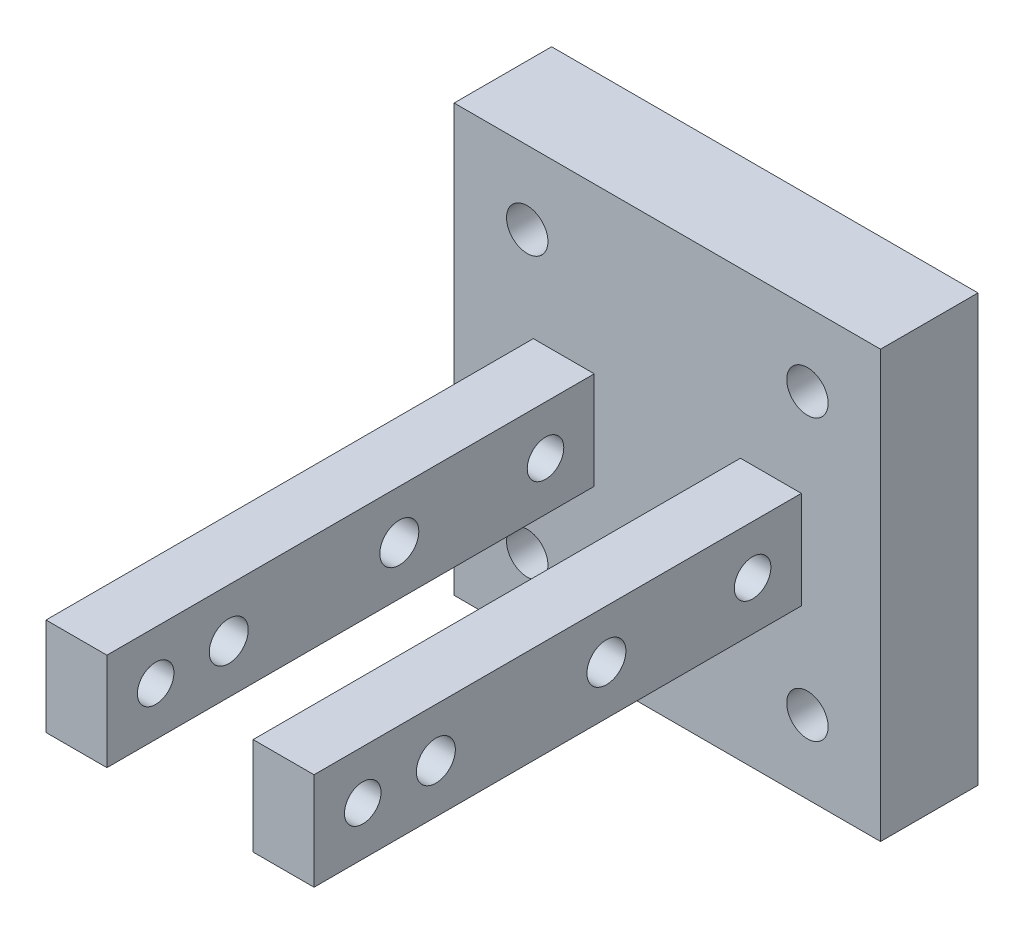
ISO-10303-21;
HEADER;
FILE_DESCRIPTION(('STEP AP214'),'2;1');
FILE_NAME('part.step','',(''),(''),'','','');
FILE_SCHEMA(('AUTOMOTIVE_DESIGN { 1 0 10303 214 1 1 1 1 }'));
ENDSEC;
DATA;
#1=APPLICATION_CONTEXT('core data for automotive mechanical design processes');
#2=APPLICATION_PROTOCOL_DEFINITION('international standard','automotive_design',2000,#1);
#3=PRODUCT_CONTEXT('',#1,'mechanical');
#4=PRODUCT('Part','Part','',(#3));
#5=PRODUCT_RELATED_PRODUCT_CATEGORY('part','',(#4));
#6=PRODUCT_DEFINITION_FORMATION('','',#4);
#7=PRODUCT_DEFINITION_CONTEXT('part definition',#1,'design');
#8=PRODUCT_DEFINITION('design','',#6,#7);
#9=PRODUCT_DEFINITION_SHAPE('','',#8);
#10=(LENGTH_UNIT() NAMED_UNIT(*) SI_UNIT(.MILLI.,.METRE.));
#11=(NAMED_UNIT(*) PLANE_ANGLE_UNIT() SI_UNIT($,.RADIAN.));
#12=(NAMED_UNIT(*) SI_UNIT($,.STERADIAN.) SOLID_ANGLE_UNIT());
#13=UNCERTAINTY_MEASURE_WITH_UNIT(LENGTH_MEASURE(1.E-05),#10,'distance_accuracy_value','');
#14=(GEOMETRIC_REPRESENTATION_CONTEXT(3) GLOBAL_UNCERTAINTY_ASSIGNED_CONTEXT((#13)) GLOBAL_UNIT_ASSIGNED_CONTEXT((#10,
#11,#12)) REPRESENTATION_CONTEXT('',''));
#15=CARTESIAN_POINT('',(0.,0.,0.));
#16=DIRECTION('',(0.,0.,1.));
#17=DIRECTION('',(1.,0.,0.));
#18=AXIS2_PLACEMENT_3D('',#15,#16,#17);
#19=CARTESIAN_POINT('',(0.,0.,8.));
#20=DIRECTION('',(0.,0.,1.));
#21=DIRECTION('',(1.,0.,0.));
#22=AXIS2_PLACEMENT_3D('',#19,#20,#21);
#23=PLANE('',#22);
#24=DIRECTION('',(0.,-1.,0.));
#25=VECTOR('',#24,1.);
#26=CARTESIAN_POINT('',(17.7,0.,8.));
#27=LINE('',#26,#25);
#28=CARTESIAN_POINT('',(17.7,-2.93142857142857,8.));
#29=VERTEX_POINT('',#28);
#30=CARTESIAN_POINT('',(17.7,-10.9314285714286,8.));
#31=VERTEX_POINT('',#30);
#32=EDGE_CURVE('E133',#29,#31,#27,.T.);
#33=ORIENTED_EDGE('',*,*,#32,.T.);
#34=DIRECTION('',(1.,0.,0.));
#35=VECTOR('',#34,1.);
#36=CARTESIAN_POINT('',(0.,-10.9314285714286,8.));
#37=LINE('',#36,#35);
#38=CARTESIAN_POINT('',(12.7,-10.9314285714286,8.));
#39=VERTEX_POINT('',#38);
#40=EDGE_CURVE('E147',#39,#31,#37,.T.);
#41=ORIENTED_EDGE('',*,*,#40,.F.);
#42=DIRECTION('',(0.,-1.,0.));
#43=VECTOR('',#42,1.);
#44=CARTESIAN_POINT('',(12.7,0.,8.));
#45=LINE('',#44,#43);
#46=CARTESIAN_POINT('',(12.7,-2.93142857142857,8.));
#47=VERTEX_POINT('',#46);
#48=EDGE_CURVE('E162',#47,#39,#45,.T.);
#49=ORIENTED_EDGE('',*,*,#48,.F.);
#50=DIRECTION('',(1.,0.,0.));
#51=VECTOR('',#50,1.);
#52=CARTESIAN_POINT('',(0.,-2.93142857142858,8.));
#53=LINE('',#52,#51);
#54=EDGE_CURVE('E159',#47,#29,#53,.T.);
#55=ORIENTED_EDGE('',*,*,#54,.T.);
#56=EDGE_LOOP('',(#33,#41,#49,#55));
#57=FACE_BOUND('',#56,.T.);
#58=CARTESIAN_POINT('',(-4.8,-18.4314285714286,8.));
#59=DIRECTION('',(0.,0.,1.));
#60=DIRECTION('',(1.,0.,0.));
#61=AXIS2_PLACEMENT_3D('',#58,#59,#60);
#62=CIRCLE('',#61,1.7);
#63=CARTESIAN_POINT('',(-3.1,-18.4314285714286,8.));
#64=VERTEX_POINT('',#63);
#65=EDGE_CURVE('E204',#64,#64,#62,.T.);
#66=ORIENTED_EDGE('',*,*,#65,.F.);
#67=EDGE_LOOP('',(#66));
#68=FACE_BOUND('',#67,.T.);
#69=CARTESIAN_POINT('',(-4.80000000000001,4.56857142857142,8.));
#70=DIRECTION('',(0.,0.,1.));
#71=DIRECTION('',(1.,0.,0.));
#72=AXIS2_PLACEMENT_3D('',#69,#70,#71);
#73=CIRCLE('',#72,1.7);
#74=CARTESIAN_POINT('',(-3.10000000000001,4.56857142857142,8.));
#75=VERTEX_POINT('',#74);
#76=EDGE_CURVE('E216',#75,#75,#73,.T.);
#77=ORIENTED_EDGE('',*,*,#76,.F.);
#78=EDGE_LOOP('',(#77));
#79=FACE_BOUND('',#78,.T.);
#80=DIRECTION('',(0.,-1.,0.));
#81=VECTOR('',#80,1.);
#82=CARTESIAN_POINT('',(-10.8,10.5685714285714,8.));
#83=LINE('',#82,#81);
#84=CARTESIAN_POINT('',(-10.8,10.5685714285714,8.));
#85=VERTEX_POINT('',#84);
#86=CARTESIAN_POINT('',(-10.8,-24.4314285714286,8.));
#87=VERTEX_POINT('',#86);
#88=EDGE_CURVE('E222',#85,#87,#83,.T.);
#89=ORIENTED_EDGE('',*,*,#88,.T.);
#90=DIRECTION('',(1.,0.,0.));
#91=VECTOR('',#90,1.);
#92=CARTESIAN_POINT('',(-10.8,-24.4314285714286,8.));
#93=LINE('',#92,#91);
#94=CARTESIAN_POINT('',(24.2,-24.4314285714286,8.));
#95=VERTEX_POINT('',#94);
#96=EDGE_CURVE('E225',#87,#95,#93,.T.);
#97=ORIENTED_EDGE('',*,*,#96,.T.);
#98=DIRECTION('',(0.,1.,0.));
#99=VECTOR('',#98,1.);
#100=CARTESIAN_POINT('',(24.2,10.5685714285714,8.));
#101=LINE('',#100,#99);
#102=CARTESIAN_POINT('',(24.2,10.5685714285714,8.));
#103=VERTEX_POINT('',#102);
#104=EDGE_CURVE('E228',#95,#103,#101,.T.);
#105=ORIENTED_EDGE('',*,*,#104,.T.);
#106=DIRECTION('',(-1.,0.,0.));
#107=VECTOR('',#106,1.);
#108=CARTESIAN_POINT('',(-10.8,10.5685714285714,8.));
#109=LINE('',#108,#107);
#110=EDGE_CURVE('E230',#103,#85,#109,.T.);
#111=ORIENTED_EDGE('',*,*,#110,.T.);
#112=EDGE_LOOP('',(#89,#97,#105,#111));
#113=FACE_BOUND('',#112,.T.);
#114=CARTESIAN_POINT('',(18.2,4.56857142857143,8.));
#115=DIRECTION('',(0.,0.,1.));
#116=DIRECTION('',(1.,0.,0.));
#117=AXIS2_PLACEMENT_3D('',#114,#115,#116);
#118=CIRCLE('',#117,1.7);
#119=CARTESIAN_POINT('',(19.9,4.56857142857143,8.));
#120=VERTEX_POINT('',#119);
#121=EDGE_CURVE('E210',#120,#120,#118,.T.);
#122=ORIENTED_EDGE('',*,*,#121,.F.);
#123=EDGE_LOOP('',(#122));
#124=FACE_BOUND('',#123,.T.);
#125=CARTESIAN_POINT('',(18.2,-18.4314285714286,8.));
#126=DIRECTION('',(0.,0.,1.));
#127=DIRECTION('',(1.,0.,0.));
#128=AXIS2_PLACEMENT_3D('',#125,#126,#127);
#129=CIRCLE('',#128,1.7);
#130=CARTESIAN_POINT('',(19.9,-18.4314285714286,8.));
#131=VERTEX_POINT('',#130);
#132=EDGE_CURVE('E198',#131,#131,#129,.T.);
#133=ORIENTED_EDGE('',*,*,#132,.F.);
#134=EDGE_LOOP('',(#133));
#135=FACE_BOUND('',#134,.T.);
#136=DIRECTION('',(0.,-1.,0.));
#137=VECTOR('',#136,1.);
#138=CARTESIAN_POINT('',(-4.30000000000001,0.,8.));
#139=LINE('',#138,#137);
#140=CARTESIAN_POINT('',(-4.30000000000001,-2.93142857142857,8.));
#141=VERTEX_POINT('',#140);
#142=CARTESIAN_POINT('',(-4.3,-10.9314285714286,8.));
#143=VERTEX_POINT('',#142);
#144=EDGE_CURVE('E60',#141,#143,#139,.T.);
#145=ORIENTED_EDGE('',*,*,#144,.F.);
#146=DIRECTION('',(-1.,0.,0.));
#147=VECTOR('',#146,1.);
#148=CARTESIAN_POINT('',(0.,-2.93142857142857,8.));
#149=LINE('',#148,#147);
#150=CARTESIAN_POINT('',(0.699999999999994,-2.93142857142857,8.));
#151=VERTEX_POINT('',#150);
#152=EDGE_CURVE('E138',#151,#141,#149,.T.);
#153=ORIENTED_EDGE('',*,*,#152,.F.);
#154=DIRECTION('',(0.,-1.,0.));
#155=VECTOR('',#154,1.);
#156=CARTESIAN_POINT('',(0.699999999999993,0.,8.));
#157=LINE('',#156,#155);
#158=CARTESIAN_POINT('',(0.699999999999996,-10.9314285714286,8.));
#159=VERTEX_POINT('',#158);
#160=EDGE_CURVE('E172',#151,#159,#157,.T.);
#161=ORIENTED_EDGE('',*,*,#160,.T.);
#162=DIRECTION('',(-1.,0.,0.));
#163=VECTOR('',#162,1.);
#164=CARTESIAN_POINT('',(0.,-10.9314285714286,8.));
#165=LINE('',#164,#163);
#166=EDGE_CURVE('E184',#159,#143,#165,.T.);
#167=ORIENTED_EDGE('',*,*,#166,.T.);
#168=EDGE_LOOP('',(#145,#153,#161,#167));
#169=FACE_BOUND('',#168,.T.);
#170=ADVANCED_FACE('F35',(#57,#68,#79,#113,#124,#135,#169),#23,.T.);
#171=CARTESIAN_POINT('',(0.,0.,0.));
#172=DIRECTION('',(0.,0.,1.));
#173=DIRECTION('',(1.,0.,0.));
#174=AXIS2_PLACEMENT_3D('',#171,#172,#173);
#175=PLANE('',#174);
#176=DIRECTION('',(0.,-1.,0.));
#177=VECTOR('',#176,1.);
#178=CARTESIAN_POINT('',(-10.8,10.5685714285714,0.));
#179=LINE('',#178,#177);
#180=CARTESIAN_POINT('',(-10.8,10.5685714285714,0.));
#181=VERTEX_POINT('',#180);
#182=CARTESIAN_POINT('',(-10.8,-24.4314285714286,0.));
#183=VERTEX_POINT('',#182);
#184=EDGE_CURVE('E219',#181,#183,#179,.T.);
#185=ORIENTED_EDGE('',*,*,#184,.F.);
#186=DIRECTION('',(-1.,0.,0.));
#187=VECTOR('',#186,1.);
#188=CARTESIAN_POINT('',(-10.8,10.5685714285714,0.));
#189=LINE('',#188,#187);
#190=CARTESIAN_POINT('',(24.2,10.5685714285714,0.));
#191=VERTEX_POINT('',#190);
#192=EDGE_CURVE('E226',#191,#181,#189,.T.);
#193=ORIENTED_EDGE('',*,*,#192,.F.);
#194=DIRECTION('',(0.,1.,0.));
#195=VECTOR('',#194,1.);
#196=CARTESIAN_POINT('',(24.2,10.5685714285714,0.));
#197=LINE('',#196,#195);
#198=CARTESIAN_POINT('',(24.2,-24.4314285714286,0.));
#199=VERTEX_POINT('',#198);
#200=EDGE_CURVE('E237',#199,#191,#197,.T.);
#201=ORIENTED_EDGE('',*,*,#200,.F.);
#202=DIRECTION('',(1.,0.,0.));
#203=VECTOR('',#202,1.);
#204=CARTESIAN_POINT('',(-10.8,-24.4314285714286,0.));
#205=LINE('',#204,#203);
#206=EDGE_CURVE('E235',#183,#199,#205,.T.);
#207=ORIENTED_EDGE('',*,*,#206,.F.);
#208=EDGE_LOOP('',(#185,#193,#201,#207));
#209=FACE_BOUND('',#208,.T.);
#210=CARTESIAN_POINT('',(-4.80000000000001,4.56857142857142,0.));
#211=DIRECTION('',(0.,0.,1.));
#212=DIRECTION('',(1.,0.,0.));
#213=AXIS2_PLACEMENT_3D('',#210,#211,#212);
#214=CIRCLE('',#213,1.7);
#215=CARTESIAN_POINT('',(-3.10000000000001,4.56857142857142,0.));
#216=VERTEX_POINT('',#215);
#217=EDGE_CURVE('E213',#216,#216,#214,.T.);
#218=ORIENTED_EDGE('',*,*,#217,.T.);
#219=EDGE_LOOP('',(#218));
#220=FACE_BOUND('',#219,.T.);
#221=CARTESIAN_POINT('',(18.2,4.56857142857143,0.));
#222=DIRECTION('',(0.,0.,1.));
#223=DIRECTION('',(1.,0.,0.));
#224=AXIS2_PLACEMENT_3D('',#221,#222,#223);
#225=CIRCLE('',#224,1.7);
#226=CARTESIAN_POINT('',(19.9,4.56857142857143,0.));
#227=VERTEX_POINT('',#226);
#228=EDGE_CURVE('E207',#227,#227,#225,.T.);
#229=ORIENTED_EDGE('',*,*,#228,.T.);
#230=EDGE_LOOP('',(#229));
#231=FACE_BOUND('',#230,.T.);
#232=CARTESIAN_POINT('',(-4.8,-18.4314285714286,0.));
#233=DIRECTION('',(0.,0.,1.));
#234=DIRECTION('',(1.,0.,0.));
#235=AXIS2_PLACEMENT_3D('',#232,#233,#234);
#236=CIRCLE('',#235,1.7);
#237=CARTESIAN_POINT('',(-3.1,-18.4314285714286,0.));
#238=VERTEX_POINT('',#237);
#239=EDGE_CURVE('E201',#238,#238,#236,.T.);
#240=ORIENTED_EDGE('',*,*,#239,.T.);
#241=EDGE_LOOP('',(#240));
#242=FACE_BOUND('',#241,.T.);
#243=CARTESIAN_POINT('',(18.2,-18.4314285714286,0.));
#244=DIRECTION('',(0.,0.,1.));
#245=DIRECTION('',(1.,0.,0.));
#246=AXIS2_PLACEMENT_3D('',#243,#244,#245);
#247=CIRCLE('',#246,1.7);
#248=CARTESIAN_POINT('',(19.9,-18.4314285714286,0.));
#249=VERTEX_POINT('',#248);
#250=EDGE_CURVE('E197',#249,#249,#247,.T.);
#251=ORIENTED_EDGE('',*,*,#250,.T.);
#252=EDGE_LOOP('',(#251));
#253=FACE_BOUND('',#252,.T.);
#254=ADVANCED_FACE('F318',(#209,#220,#231,#242,#253),#175,.F.);
#255=CARTESIAN_POINT('',(-10.8,10.5685714285714,8.));
#256=DIRECTION('',(1.,0.,0.));
#257=DIRECTION('',(0.,1.,0.));
#258=AXIS2_PLACEMENT_3D('',#255,#256,#257);
#259=PLANE('',#258);
#260=ORIENTED_EDGE('',*,*,#184,.T.);
#261=DIRECTION('',(0.,0.,-1.));
#262=VECTOR('',#261,1.);
#263=CARTESIAN_POINT('',(-10.8,-24.4314285714286,8.));
#264=LINE('',#263,#262);
#265=EDGE_CURVE('E11',#87,#183,#264,.T.);
#266=ORIENTED_EDGE('',*,*,#265,.F.);
#267=ORIENTED_EDGE('',*,*,#88,.F.);
#268=DIRECTION('',(0.,0.,-1.));
#269=VECTOR('',#268,1.);
#270=CARTESIAN_POINT('',(-10.8,10.5685714285714,8.));
#271=LINE('',#270,#269);
#272=EDGE_CURVE('E232',#85,#181,#271,.T.);
#273=ORIENTED_EDGE('',*,*,#272,.T.);
#274=EDGE_LOOP('',(#260,#266,#267,#273));
#275=FACE_BOUND('',#274,.T.);
#276=ADVANCED_FACE('F37',(#275),#259,.F.);
#277=CARTESIAN_POINT('',(-10.8,-24.4314285714286,8.));
#278=DIRECTION('',(0.,1.,0.));
#279=DIRECTION('',(0.,0.,1.));
#280=AXIS2_PLACEMENT_3D('',#277,#278,#279);
#281=PLANE('',#280);
#282=ORIENTED_EDGE('',*,*,#206,.T.);
#283=DIRECTION('',(0.,0.,-1.));
#284=VECTOR('',#283,1.);
#285=CARTESIAN_POINT('',(24.2,-24.4314285714286,8.));
#286=LINE('',#285,#284);
#287=EDGE_CURVE('E44',#95,#199,#286,.T.);
#288=ORIENTED_EDGE('',*,*,#287,.F.);
#289=ORIENTED_EDGE('',*,*,#96,.F.);
#290=ORIENTED_EDGE('',*,*,#265,.T.);
#291=EDGE_LOOP('',(#282,#288,#289,#290));
#292=FACE_BOUND('',#291,.T.);
#293=ADVANCED_FACE('F337',(#292),#281,.F.);
#294=CARTESIAN_POINT('',(24.2,10.5685714285714,8.));
#295=DIRECTION('',(-1.,0.,0.));
#296=DIRECTION('',(0.,-1.,0.));
#297=AXIS2_PLACEMENT_3D('',#294,#295,#296);
#298=PLANE('',#297);
#299=ORIENTED_EDGE('',*,*,#200,.T.);
#300=DIRECTION('',(0.,0.,-1.));
#301=VECTOR('',#300,1.);
#302=CARTESIAN_POINT('',(24.2,10.5685714285714,8.));
#303=LINE('',#302,#301);
#304=EDGE_CURVE('E242',#103,#191,#303,.T.);
#305=ORIENTED_EDGE('',*,*,#304,.F.);
#306=ORIENTED_EDGE('',*,*,#104,.F.);
#307=ORIENTED_EDGE('',*,*,#287,.T.);
#308=EDGE_LOOP('',(#299,#305,#306,#307));
#309=FACE_BOUND('',#308,.T.);
#310=ADVANCED_FACE('F334',(#309),#298,.F.);
#311=CARTESIAN_POINT('',(-10.8,10.5685714285714,8.));
#312=DIRECTION('',(0.,-1.,0.));
#313=DIRECTION('',(0.,0.,-1.));
#314=AXIS2_PLACEMENT_3D('',#311,#312,#313);
#315=PLANE('',#314);
#316=ORIENTED_EDGE('',*,*,#192,.T.);
#317=ORIENTED_EDGE('',*,*,#272,.F.);
#318=ORIENTED_EDGE('',*,*,#110,.F.);
#319=ORIENTED_EDGE('',*,*,#304,.T.);
#320=EDGE_LOOP('',(#316,#317,#318,#319));
#321=FACE_BOUND('',#320,.T.);
#322=ADVANCED_FACE('F331',(#321),#315,.F.);
#323=CARTESIAN_POINT('',(-4.80000000000001,4.56857142857142,8.));
#324=DIRECTION('',(0.,0.,-1.));
#325=DIRECTION('',(-1.,0.,0.));
#326=AXIS2_PLACEMENT_3D('',#323,#324,#325);
#327=CYLINDRICAL_SURFACE('',#326,1.7);
#328=ORIENTED_EDGE('',*,*,#76,.T.);
#329=EDGE_LOOP('',(#328));
#330=FACE_BOUND('',#329,.T.);
#331=ORIENTED_EDGE('',*,*,#217,.F.);
#332=EDGE_LOOP('',(#331));
#333=FACE_BOUND('',#332,.T.);
#334=ADVANCED_FACE('F328',(#330,#333),#327,.F.);
#335=CARTESIAN_POINT('',(18.2,4.56857142857143,8.));
#336=DIRECTION('',(0.,0.,-1.));
#337=DIRECTION('',(-1.,0.,0.));
#338=AXIS2_PLACEMENT_3D('',#335,#336,#337);
#339=CYLINDRICAL_SURFACE('',#338,1.7);
#340=ORIENTED_EDGE('',*,*,#121,.T.);
#341=EDGE_LOOP('',(#340));
#342=FACE_BOUND('',#341,.T.);
#343=ORIENTED_EDGE('',*,*,#228,.F.);
#344=EDGE_LOOP('',(#343));
#345=FACE_BOUND('',#344,.T.);
#346=ADVANCED_FACE('F376',(#342,#345),#339,.F.);
#347=CARTESIAN_POINT('',(-4.8,-18.4314285714286,8.));
#348=DIRECTION('',(0.,0.,-1.));
#349=DIRECTION('',(-1.,0.,0.));
#350=AXIS2_PLACEMENT_3D('',#347,#348,#349);
#351=CYLINDRICAL_SURFACE('',#350,1.7);
#352=ORIENTED_EDGE('',*,*,#65,.T.);
#353=EDGE_LOOP('',(#352));
#354=FACE_BOUND('',#353,.T.);
#355=ORIENTED_EDGE('',*,*,#239,.F.);
#356=EDGE_LOOP('',(#355));
#357=FACE_BOUND('',#356,.T.);
#358=ADVANCED_FACE('F366',(#354,#357),#351,.F.);
#359=CARTESIAN_POINT('',(18.2,-18.4314285714286,8.));
#360=DIRECTION('',(0.,0.,-1.));
#361=DIRECTION('',(-1.,0.,0.));
#362=AXIS2_PLACEMENT_3D('',#359,#360,#361);
#363=CYLINDRICAL_SURFACE('',#362,1.7);
#364=ORIENTED_EDGE('',*,*,#132,.T.);
#365=EDGE_LOOP('',(#364));
#366=FACE_BOUND('',#365,.T.);
#367=ORIENTED_EDGE('',*,*,#250,.F.);
#368=EDGE_LOOP('',(#367));
#369=FACE_BOUND('',#368,.T.);
#370=ADVANCED_FACE('F362',(#366,#369),#363,.F.);
#371=CARTESIAN_POINT('',(0.,-2.93142857142857,48.));
#372=DIRECTION('',(0.,-1.,0.));
#373=DIRECTION('',(1.,0.,0.));
#374=AXIS2_PLACEMENT_3D('',#371,#372,#373);
#375=PLANE('',#374);
#376=ORIENTED_EDGE('',*,*,#152,.T.);
#377=DIRECTION('',(0.,0.,-1.));
#378=VECTOR('',#377,1.);
#379=CARTESIAN_POINT('',(-4.30000000000001,-2.93142857142857,48.));
#380=LINE('',#379,#378);
#381=CARTESIAN_POINT('',(-4.30000000000001,-2.93142857142857,48.));
#382=VERTEX_POINT('',#381);
#383=EDGE_CURVE('E195',#382,#141,#380,.T.);
#384=ORIENTED_EDGE('',*,*,#383,.F.);
#385=DIRECTION('',(-1.,0.,0.));
#386=VECTOR('',#385,1.);
#387=CARTESIAN_POINT('',(0.,-2.93142857142857,48.));
#388=LINE('',#387,#386);
#389=CARTESIAN_POINT('',(0.699999999999994,-2.93142857142857,48.));
#390=VERTEX_POINT('',#389);
#391=EDGE_CURVE('E168',#390,#382,#388,.T.);
#392=ORIENTED_EDGE('',*,*,#391,.F.);
#393=DIRECTION('',(0.,0.,-1.));
#394=VECTOR('',#393,1.);
#395=CARTESIAN_POINT('',(0.699999999999994,-2.93142857142857,48.));
#396=LINE('',#395,#394);
#397=EDGE_CURVE('E180',#390,#151,#396,.T.);
#398=ORIENTED_EDGE('',*,*,#397,.T.);
#399=EDGE_LOOP('',(#376,#384,#392,#398));
#400=FACE_BOUND('',#399,.T.);
#401=ADVANCED_FACE('F365',(#400),#375,.F.);
#402=CARTESIAN_POINT('',(-4.30000000000001,0.,48.));
#403=DIRECTION('',(1.,0.,0.));
#404=DIRECTION('',(0.,1.,0.));
#405=AXIS2_PLACEMENT_3D('',#402,#403,#404);
#406=PLANE('',#405);
#407=CARTESIAN_POINT('',(-4.3,-6.93142857142857,12.));
#408=DIRECTION('',(-1.,0.,0.));
#409=DIRECTION('',(0.,-1.,0.));
#410=AXIS2_PLACEMENT_3D('',#407,#408,#409);
#411=CIRCLE('',#410,1.5);
#412=CARTESIAN_POINT('',(-4.3,-8.43142857142857,12.));
#413=VERTEX_POINT('',#412);
#414=EDGE_CURVE('E259',#413,#413,#411,.T.);
#415=ORIENTED_EDGE('',*,*,#414,.F.);
#416=EDGE_LOOP('',(#415));
#417=FACE_BOUND('',#416,.T.);
#418=CARTESIAN_POINT('',(-4.3,-6.93142857142856,44.));
#419=DIRECTION('',(-1.,0.,0.));
#420=DIRECTION('',(0.,-1.,0.));
#421=AXIS2_PLACEMENT_3D('',#418,#419,#420);
#422=CIRCLE('',#421,1.5);
#423=CARTESIAN_POINT('',(-4.3,-8.43142857142857,44.));
#424=VERTEX_POINT('',#423);
#425=EDGE_CURVE('E266',#424,#424,#422,.T.);
#426=ORIENTED_EDGE('',*,*,#425,.F.);
#427=EDGE_LOOP('',(#426));
#428=FACE_BOUND('',#427,.T.);
#429=CARTESIAN_POINT('',(-4.30000000000001,-6.93142857142858,38.));
#430=DIRECTION('',(1.,0.,0.));
#431=DIRECTION('',(0.,1.,0.));
#432=AXIS2_PLACEMENT_3D('',#429,#430,#431);
#433=CIRCLE('',#432,1.6);
#434=CARTESIAN_POINT('',(-4.30000000000001,-5.33142857142858,38.));
#435=VERTEX_POINT('',#434);
#436=EDGE_CURVE('E160',#435,#435,#433,.T.);
#437=ORIENTED_EDGE('',*,*,#436,.T.);
#438=EDGE_LOOP('',(#437));
#439=FACE_BOUND('',#438,.T.);
#440=CARTESIAN_POINT('',(-4.30000000000001,-6.93142857142858,24.));
#441=DIRECTION('',(1.,0.,0.));
#442=DIRECTION('',(0.,1.,0.));
#443=AXIS2_PLACEMENT_3D('',#440,#441,#442);
#444=CIRCLE('',#443,1.6);
#445=CARTESIAN_POINT('',(-4.30000000000001,-5.33142857142857,24.));
#446=VERTEX_POINT('',#445);
#447=EDGE_CURVE('E255',#446,#446,#444,.T.);
#448=ORIENTED_EDGE('',*,*,#447,.T.);
#449=EDGE_LOOP('',(#448));
#450=FACE_BOUND('',#449,.T.);
#451=ORIENTED_EDGE('',*,*,#144,.T.);
#452=DIRECTION('',(0.,0.,-1.));
#453=VECTOR('',#452,1.);
#454=CARTESIAN_POINT('',(-4.3,-10.9314285714286,48.));
#455=LINE('',#454,#453);
#456=CARTESIAN_POINT('',(-4.3,-10.9314285714286,48.));
#457=VERTEX_POINT('',#456);
#458=EDGE_CURVE('E192',#457,#143,#455,.T.);
#459=ORIENTED_EDGE('',*,*,#458,.F.);
#460=DIRECTION('',(0.,-1.,0.));
#461=VECTOR('',#460,1.);
#462=CARTESIAN_POINT('',(-4.30000000000001,0.,48.));
#463=LINE('',#462,#461);
#464=EDGE_CURVE('E171',#382,#457,#463,.T.);
#465=ORIENTED_EDGE('',*,*,#464,.F.);
#466=ORIENTED_EDGE('',*,*,#383,.T.);
#467=EDGE_LOOP('',(#451,#459,#465,#466));
#468=FACE_BOUND('',#467,.T.);
#469=ADVANCED_FACE('F294',(#417,#428,#439,#450,#468),#406,.F.);
#470=CARTESIAN_POINT('',(0.,-10.9314285714286,48.));
#471=DIRECTION('',(0.,-1.,0.));
#472=DIRECTION('',(0.,0.,-1.));
#473=AXIS2_PLACEMENT_3D('',#470,#471,#472);
#474=PLANE('',#473);
#475=ORIENTED_EDGE('',*,*,#166,.F.);
#476=DIRECTION('',(0.,0.,-1.));
#477=VECTOR('',#476,1.);
#478=CARTESIAN_POINT('',(0.699999999999996,-10.9314285714286,48.));
#479=LINE('',#478,#477);
#480=CARTESIAN_POINT('',(0.699999999999996,-10.9314285714286,48.));
#481=VERTEX_POINT('',#480);
#482=EDGE_CURVE('E189',#481,#159,#479,.T.);
#483=ORIENTED_EDGE('',*,*,#482,.F.);
#484=DIRECTION('',(-1.,0.,0.));
#485=VECTOR('',#484,1.);
#486=CARTESIAN_POINT('',(0.,-10.9314285714286,48.));
#487=LINE('',#486,#485);
#488=EDGE_CURVE('E174',#481,#457,#487,.T.);
#489=ORIENTED_EDGE('',*,*,#488,.T.);
#490=ORIENTED_EDGE('',*,*,#458,.T.);
#491=EDGE_LOOP('',(#475,#483,#489,#490));
#492=FACE_BOUND('',#491,.T.);
#493=ADVANCED_FACE('F459',(#492),#474,.T.);
#494=CARTESIAN_POINT('',(0.699999999999993,0.,48.));
#495=DIRECTION('',(1.,0.,0.));
#496=DIRECTION('',(0.,1.,0.));
#497=AXIS2_PLACEMENT_3D('',#494,#495,#496);
#498=PLANE('',#497);
#499=CARTESIAN_POINT('',(0.699999999999996,-6.93142857142857,12.));
#500=DIRECTION('',(1.,0.,0.));
#501=DIRECTION('',(0.,1.,0.));
#502=AXIS2_PLACEMENT_3D('',#499,#500,#501);
#503=CIRCLE('',#502,1.5);
#504=CARTESIAN_POINT('',(0.699999999999995,-5.43142857142857,12.));
#505=VERTEX_POINT('',#504);
#506=EDGE_CURVE('E278',#505,#505,#503,.T.);
#507=ORIENTED_EDGE('',*,*,#506,.F.);
#508=EDGE_LOOP('',(#507));
#509=FACE_BOUND('',#508,.T.);
#510=CARTESIAN_POINT('',(0.699999999999996,-6.93142857142856,44.));
#511=DIRECTION('',(1.,0.,0.));
#512=DIRECTION('',(0.,1.,0.));
#513=AXIS2_PLACEMENT_3D('',#510,#511,#512);
#514=CIRCLE('',#513,1.5);
#515=CARTESIAN_POINT('',(0.699999999999995,-5.43142857142856,44.));
#516=VERTEX_POINT('',#515);
#517=EDGE_CURVE('E263',#516,#516,#514,.T.);
#518=ORIENTED_EDGE('',*,*,#517,.F.);
#519=EDGE_LOOP('',(#518));
#520=FACE_BOUND('',#519,.T.);
#521=CARTESIAN_POINT('',(0.699999999999996,-6.93142857142857,38.));
#522=DIRECTION('',(1.,0.,0.));
#523=DIRECTION('',(0.,1.,0.));
#524=AXIS2_PLACEMENT_3D('',#521,#522,#523);
#525=CIRCLE('',#524,1.6);
#526=CARTESIAN_POINT('',(0.699999999999995,-5.33142857142858,38.));
#527=VERTEX_POINT('',#526);
#528=EDGE_CURVE('E254',#527,#527,#525,.T.);
#529=ORIENTED_EDGE('',*,*,#528,.F.);
#530=EDGE_LOOP('',(#529));
#531=FACE_BOUND('',#530,.T.);
#532=CARTESIAN_POINT('',(0.699999999999996,-6.93142857142857,24.));
#533=DIRECTION('',(1.,0.,0.));
#534=DIRECTION('',(0.,1.,0.));
#535=AXIS2_PLACEMENT_3D('',#532,#533,#534);
#536=CIRCLE('',#535,1.6);
#537=CARTESIAN_POINT('',(0.699999999999995,-5.33142857142857,24.));
#538=VERTEX_POINT('',#537);
#539=EDGE_CURVE('E250',#538,#538,#536,.T.);
#540=ORIENTED_EDGE('',*,*,#539,.F.);
#541=EDGE_LOOP('',(#540));
#542=FACE_BOUND('',#541,.T.);
#543=ORIENTED_EDGE('',*,*,#160,.F.);
#544=ORIENTED_EDGE('',*,*,#397,.F.);
#545=DIRECTION('',(0.,-1.,0.));
#546=VECTOR('',#545,1.);
#547=CARTESIAN_POINT('',(0.699999999999993,0.,48.));
#548=LINE('',#547,#546);
#549=EDGE_CURVE('E177',#390,#481,#548,.T.);
#550=ORIENTED_EDGE('',*,*,#549,.T.);
#551=ORIENTED_EDGE('',*,*,#482,.T.);
#552=EDGE_LOOP('',(#543,#544,#550,#551));
#553=FACE_BOUND('',#552,.T.);
#554=ADVANCED_FACE('F466',(#509,#520,#531,#542,#553),#498,.T.);
#555=CARTESIAN_POINT('',(0.,0.,48.));
#556=DIRECTION('',(0.,0.,1.));
#557=DIRECTION('',(1.,0.,0.));
#558=AXIS2_PLACEMENT_3D('',#555,#556,#557);
#559=PLANE('',#558);
#560=ORIENTED_EDGE('',*,*,#391,.T.);
#561=ORIENTED_EDGE('',*,*,#464,.T.);
#562=ORIENTED_EDGE('',*,*,#488,.F.);
#563=ORIENTED_EDGE('',*,*,#549,.F.);
#564=EDGE_LOOP('',(#560,#561,#562,#563));
#565=FACE_BOUND('',#564,.T.);
#566=ADVANCED_FACE('F475',(#565),#559,.T.);
#567=CARTESIAN_POINT('',(17.7,0.,48.));
#568=DIRECTION('',(1.,0.,0.));
#569=DIRECTION('',(0.,1.,0.));
#570=AXIS2_PLACEMENT_3D('',#567,#568,#569);
#571=PLANE('',#570);
#572=CARTESIAN_POINT('',(17.7,-6.93142857142856,12.));
#573=DIRECTION('',(1.,0.,0.));
#574=DIRECTION('',(0.,1.,0.));
#575=AXIS2_PLACEMENT_3D('',#572,#573,#574);
#576=CIRCLE('',#575,1.5);
#577=CARTESIAN_POINT('',(17.7,-5.43142857142856,12.));
#578=VERTEX_POINT('',#577);
#579=EDGE_CURVE('E275',#578,#578,#576,.T.);
#580=ORIENTED_EDGE('',*,*,#579,.F.);
#581=EDGE_LOOP('',(#580));
#582=FACE_BOUND('',#581,.T.);
#583=CARTESIAN_POINT('',(17.7,-6.93142857142856,44.));
#584=DIRECTION('',(1.,0.,0.));
#585=DIRECTION('',(0.,1.,0.));
#586=AXIS2_PLACEMENT_3D('',#583,#584,#585);
#587=CIRCLE('',#586,1.5);
#588=CARTESIAN_POINT('',(17.7,-5.43142857142855,44.));
#589=VERTEX_POINT('',#588);
#590=EDGE_CURVE('E258',#589,#589,#587,.T.);
#591=ORIENTED_EDGE('',*,*,#590,.F.);
#592=EDGE_LOOP('',(#591));
#593=FACE_BOUND('',#592,.T.);
#594=CARTESIAN_POINT('',(17.7,-6.93142857142857,38.));
#595=DIRECTION('',(1.,0.,0.));
#596=DIRECTION('',(0.,1.,0.));
#597=AXIS2_PLACEMENT_3D('',#594,#595,#596);
#598=CIRCLE('',#597,1.6);
#599=CARTESIAN_POINT('',(17.7,-5.33142857142857,38.));
#600=VERTEX_POINT('',#599);
#601=EDGE_CURVE('E251',#600,#600,#598,.T.);
#602=ORIENTED_EDGE('',*,*,#601,.F.);
#603=EDGE_LOOP('',(#602));
#604=FACE_BOUND('',#603,.T.);
#605=CARTESIAN_POINT('',(17.7,-6.93142857142857,24.));
#606=DIRECTION('',(1.,0.,0.));
#607=DIRECTION('',(0.,1.,0.));
#608=AXIS2_PLACEMENT_3D('',#605,#606,#607);
#609=CIRCLE('',#608,1.6);
#610=CARTESIAN_POINT('',(17.7,-5.33142857142856,24.));
#611=VERTEX_POINT('',#610);
#612=EDGE_CURVE('E281',#611,#611,#609,.T.);
#613=ORIENTED_EDGE('',*,*,#612,.F.);
#614=EDGE_LOOP('',(#613));
#615=FACE_BOUND('',#614,.T.);
#616=ORIENTED_EDGE('',*,*,#32,.F.);
#617=DIRECTION('',(0.,0.,-1.));
#618=VECTOR('',#617,1.);
#619=CARTESIAN_POINT('',(17.7,-2.93142857142857,48.));
#620=LINE('',#619,#618);
#621=CARTESIAN_POINT('',(17.7,-2.93142857142857,48.));
#622=VERTEX_POINT('',#621);
#623=EDGE_CURVE('E128',#622,#29,#620,.T.);
#624=ORIENTED_EDGE('',*,*,#623,.F.);
#625=DIRECTION('',(0.,-1.,0.));
#626=VECTOR('',#625,1.);
#627=CARTESIAN_POINT('',(17.7,0.,48.));
#628=LINE('',#627,#626);
#629=CARTESIAN_POINT('',(17.7,-10.9314285714286,48.));
#630=VERTEX_POINT('',#629);
#631=EDGE_CURVE('E131',#622,#630,#628,.T.);
#632=ORIENTED_EDGE('',*,*,#631,.T.);
#633=DIRECTION('',(0.,0.,-1.));
#634=VECTOR('',#633,1.);
#635=CARTESIAN_POINT('',(17.7,-10.9314285714286,48.));
#636=LINE('',#635,#634);
#637=EDGE_CURVE('E157',#630,#31,#636,.T.);
#638=ORIENTED_EDGE('',*,*,#637,.T.);
#639=EDGE_LOOP('',(#616,#624,#632,#638));
#640=FACE_BOUND('',#639,.T.);
#641=ADVANCED_FACE('F130',(#582,#593,#604,#615,#640),#571,.T.);
#642=CARTESIAN_POINT('',(0.,-2.93142857142858,48.));
#643=DIRECTION('',(0.,1.,0.));
#644=DIRECTION('',(-1.,0.,0.));
#645=AXIS2_PLACEMENT_3D('',#642,#643,#644);
#646=PLANE('',#645);
#647=ORIENTED_EDGE('',*,*,#54,.F.);
#648=DIRECTION('',(0.,0.,-1.));
#649=VECTOR('',#648,1.);
#650=CARTESIAN_POINT('',(12.7,-2.93142857142857,48.));
#651=LINE('',#650,#649);
#652=CARTESIAN_POINT('',(12.7,-2.93142857142857,48.));
#653=VERTEX_POINT('',#652);
#654=EDGE_CURVE('E139',#653,#47,#651,.T.);
#655=ORIENTED_EDGE('',*,*,#654,.F.);
#656=DIRECTION('',(1.,0.,0.));
#657=VECTOR('',#656,1.);
#658=CARTESIAN_POINT('',(0.,-2.93142857142858,48.));
#659=LINE('',#658,#657);
#660=EDGE_CURVE('E144',#653,#622,#659,.T.);
#661=ORIENTED_EDGE('',*,*,#660,.T.);
#662=ORIENTED_EDGE('',*,*,#623,.T.);
#663=EDGE_LOOP('',(#647,#655,#661,#662));
#664=FACE_BOUND('',#663,.T.);
#665=ADVANCED_FACE('F149',(#664),#646,.T.);
#666=CARTESIAN_POINT('',(12.7,0.,48.));
#667=DIRECTION('',(1.,0.,0.));
#668=DIRECTION('',(0.,1.,0.));
#669=AXIS2_PLACEMENT_3D('',#666,#667,#668);
#670=PLANE('',#669);
#671=CARTESIAN_POINT('',(12.7,-6.93142857142857,12.));
#672=DIRECTION('',(1.,0.,0.));
#673=DIRECTION('',(0.,1.,0.));
#674=AXIS2_PLACEMENT_3D('',#671,#672,#673);
#675=CIRCLE('',#674,1.5);
#676=CARTESIAN_POINT('',(12.7,-5.43142857142856,12.));
#677=VERTEX_POINT('',#676);
#678=EDGE_CURVE('E39',#677,#677,#675,.T.);
#679=ORIENTED_EDGE('',*,*,#678,.T.);
#680=EDGE_LOOP('',(#679));
#681=FACE_BOUND('',#680,.T.);
#682=CARTESIAN_POINT('',(12.7,-6.93142857142856,44.));
#683=DIRECTION('',(1.,0.,0.));
#684=DIRECTION('',(0.,1.,0.));
#685=AXIS2_PLACEMENT_3D('',#682,#683,#684);
#686=CIRCLE('',#685,1.5);
#687=CARTESIAN_POINT('',(12.7,-5.43142857142855,44.));
#688=VERTEX_POINT('',#687);
#689=EDGE_CURVE('E256',#688,#688,#686,.T.);
#690=ORIENTED_EDGE('',*,*,#689,.T.);
#691=EDGE_LOOP('',(#690));
#692=FACE_BOUND('',#691,.T.);
#693=CARTESIAN_POINT('',(12.7,-6.93142857142857,38.));
#694=DIRECTION('',(1.,0.,0.));
#695=DIRECTION('',(0.,1.,0.));
#696=AXIS2_PLACEMENT_3D('',#693,#694,#695);
#697=CIRCLE('',#696,1.6);
#698=CARTESIAN_POINT('',(12.7,-5.33142857142857,38.));
#699=VERTEX_POINT('',#698);
#700=EDGE_CURVE('E252',#699,#699,#697,.T.);
#701=ORIENTED_EDGE('',*,*,#700,.T.);
#702=EDGE_LOOP('',(#701));
#703=FACE_BOUND('',#702,.T.);
#704=CARTESIAN_POINT('',(12.7,-6.93142857142857,24.));
#705=DIRECTION('',(1.,0.,0.));
#706=DIRECTION('',(0.,1.,0.));
#707=AXIS2_PLACEMENT_3D('',#704,#705,#706);
#708=CIRCLE('',#707,1.6);
#709=CARTESIAN_POINT('',(12.7,-5.33142857142857,24.));
#710=VERTEX_POINT('',#709);
#711=EDGE_CURVE('E247',#710,#710,#708,.T.);
#712=ORIENTED_EDGE('',*,*,#711,.T.);
#713=EDGE_LOOP('',(#712));
#714=FACE_BOUND('',#713,.T.);
#715=ORIENTED_EDGE('',*,*,#48,.T.);
#716=DIRECTION('',(0.,0.,-1.));
#717=VECTOR('',#716,1.);
#718=CARTESIAN_POINT('',(12.7,-10.9314285714286,48.));
#719=LINE('',#718,#717);
#720=CARTESIAN_POINT('',(12.7,-10.9314285714286,48.));
#721=VERTEX_POINT('',#720);
#722=EDGE_CURVE('E52',#721,#39,#719,.T.);
#723=ORIENTED_EDGE('',*,*,#722,.F.);
#724=DIRECTION('',(0.,-1.,0.));
#725=VECTOR('',#724,1.);
#726=CARTESIAN_POINT('',(12.7,0.,48.));
#727=LINE('',#726,#725);
#728=EDGE_CURVE('E151',#653,#721,#727,.T.);
#729=ORIENTED_EDGE('',*,*,#728,.F.);
#730=ORIENTED_EDGE('',*,*,#654,.T.);
#731=EDGE_LOOP('',(#715,#723,#729,#730));
#732=FACE_BOUND('',#731,.T.);
#733=ADVANCED_FACE('F503',(#681,#692,#703,#714,#732),#670,.F.);
#734=CARTESIAN_POINT('',(0.,-10.9314285714286,48.));
#735=DIRECTION('',(0.,1.,0.));
#736=DIRECTION('',(0.,0.,1.));
#737=AXIS2_PLACEMENT_3D('',#734,#735,#736);
#738=PLANE('',#737);
#739=ORIENTED_EDGE('',*,*,#40,.T.);
#740=ORIENTED_EDGE('',*,*,#637,.F.);
#741=DIRECTION('',(1.,0.,0.));
#742=VECTOR('',#741,1.);
#743=CARTESIAN_POINT('',(0.,-10.9314285714286,48.));
#744=LINE('',#743,#742);
#745=EDGE_CURVE('E145',#721,#630,#744,.T.);
#746=ORIENTED_EDGE('',*,*,#745,.F.);
#747=ORIENTED_EDGE('',*,*,#722,.T.);
#748=EDGE_LOOP('',(#739,#740,#746,#747));
#749=FACE_BOUND('',#748,.T.);
#750=ADVANCED_FACE('F511',(#749),#738,.F.);
#751=CARTESIAN_POINT('',(0.,0.,48.));
#752=DIRECTION('',(0.,0.,1.));
#753=DIRECTION('',(1.,0.,0.));
#754=AXIS2_PLACEMENT_3D('',#751,#752,#753);
#755=PLANE('',#754);
#756=ORIENTED_EDGE('',*,*,#631,.F.);
#757=ORIENTED_EDGE('',*,*,#660,.F.);
#758=ORIENTED_EDGE('',*,*,#728,.T.);
#759=ORIENTED_EDGE('',*,*,#745,.T.);
#760=EDGE_LOOP('',(#756,#757,#758,#759));
#761=FACE_BOUND('',#760,.T.);
#762=ADVANCED_FACE('F143',(#761),#755,.T.);
#763=CARTESIAN_POINT('',(-22.3,-6.93142857142858,24.));
#764=DIRECTION('',(1.,0.,0.));
#765=DIRECTION('',(0.,1.,0.));
#766=AXIS2_PLACEMENT_3D('',#763,#764,#765);
#767=CYLINDRICAL_SURFACE('',#766,1.6);
#768=ORIENTED_EDGE('',*,*,#612,.T.);
#769=EDGE_LOOP('',(#768));
#770=FACE_BOUND('',#769,.T.);
#771=ORIENTED_EDGE('',*,*,#711,.F.);
#772=EDGE_LOOP('',(#771));
#773=FACE_BOUND('',#772,.T.);
#774=ADVANCED_FACE('F314',(#770,#773),#767,.F.);
#775=CARTESIAN_POINT('',(-22.3,-6.93142857142858,38.));
#776=DIRECTION('',(1.,0.,0.));
#777=DIRECTION('',(0.,1.,0.));
#778=AXIS2_PLACEMENT_3D('',#775,#776,#777);
#779=CYLINDRICAL_SURFACE('',#778,1.6);
#780=ORIENTED_EDGE('',*,*,#601,.T.);
#781=EDGE_LOOP('',(#780));
#782=FACE_BOUND('',#781,.T.);
#783=ORIENTED_EDGE('',*,*,#700,.F.);
#784=EDGE_LOOP('',(#783));
#785=FACE_BOUND('',#784,.T.);
#786=ADVANCED_FACE('F303',(#782,#785),#779,.F.);
#787=ORIENTED_EDGE('',*,*,#539,.T.);
#788=EDGE_LOOP('',(#787));
#789=FACE_BOUND('',#788,.T.);
#790=ORIENTED_EDGE('',*,*,#447,.F.);
#791=EDGE_LOOP('',(#790));
#792=FACE_BOUND('',#791,.T.);
#793=ADVANCED_FACE('F300',(#789,#792),#767,.F.);
#794=ORIENTED_EDGE('',*,*,#528,.T.);
#795=EDGE_LOOP('',(#794));
#796=FACE_BOUND('',#795,.T.);
#797=ORIENTED_EDGE('',*,*,#436,.F.);
#798=EDGE_LOOP('',(#797));
#799=FACE_BOUND('',#798,.T.);
#800=ADVANCED_FACE('F297',(#796,#799),#779,.F.);
#801=CARTESIAN_POINT('',(19.7,-6.93142857142856,44.));
#802=DIRECTION('',(-1.,0.,0.));
#803=DIRECTION('',(0.,-1.,0.));
#804=AXIS2_PLACEMENT_3D('',#801,#802,#803);
#805=CYLINDRICAL_SURFACE('',#804,1.5);
#806=ORIENTED_EDGE('',*,*,#590,.T.);
#807=EDGE_LOOP('',(#806));
#808=FACE_BOUND('',#807,.T.);
#809=ORIENTED_EDGE('',*,*,#689,.F.);
#810=EDGE_LOOP('',(#809));
#811=FACE_BOUND('',#810,.T.);
#812=ADVANCED_FACE('F299',(#808,#811),#805,.F.);
#813=CARTESIAN_POINT('',(19.7,-6.93142857142856,12.));
#814=DIRECTION('',(-1.,0.,0.));
#815=DIRECTION('',(0.,-1.,0.));
#816=AXIS2_PLACEMENT_3D('',#813,#814,#815);
#817=CYLINDRICAL_SURFACE('',#816,1.5);
#818=ORIENTED_EDGE('',*,*,#579,.T.);
#819=EDGE_LOOP('',(#818));
#820=FACE_BOUND('',#819,.T.);
#821=ORIENTED_EDGE('',*,*,#678,.F.);
#822=EDGE_LOOP('',(#821));
#823=FACE_BOUND('',#822,.T.);
#824=ADVANCED_FACE('F308',(#820,#823),#817,.F.);
#825=ORIENTED_EDGE('',*,*,#517,.T.);
#826=EDGE_LOOP('',(#825));
#827=FACE_BOUND('',#826,.T.);
#828=ORIENTED_EDGE('',*,*,#425,.T.);
#829=EDGE_LOOP('',(#828));
#830=FACE_BOUND('',#829,.T.);
#831=ADVANCED_FACE('F311',(#827,#830),#805,.F.);
#832=ORIENTED_EDGE('',*,*,#506,.T.);
#833=EDGE_LOOP('',(#832));
#834=FACE_BOUND('',#833,.T.);
#835=ORIENTED_EDGE('',*,*,#414,.T.);
#836=EDGE_LOOP('',(#835));
#837=FACE_BOUND('',#836,.T.);
#838=ADVANCED_FACE('F565',(#834,#837),#817,.F.);
#839=CLOSED_SHELL('',(#170,#254,#276,#293,#310,#322,#334,#346,#358,#370,#401,#469,#493,#554,
#566,#641,#665,#733,#750,#762,#774,#786,#793,#800,#812,#824,#831,#838));
#840=MANIFOLD_SOLID_BREP('B2',#839);
#841=ADVANCED_BREP_SHAPE_REPRESENTATION('',(#18,#840),#14);
#842=SHAPE_DEFINITION_REPRESENTATION(#9,#841);
ENDSEC;
END-ISO-10303-21;
